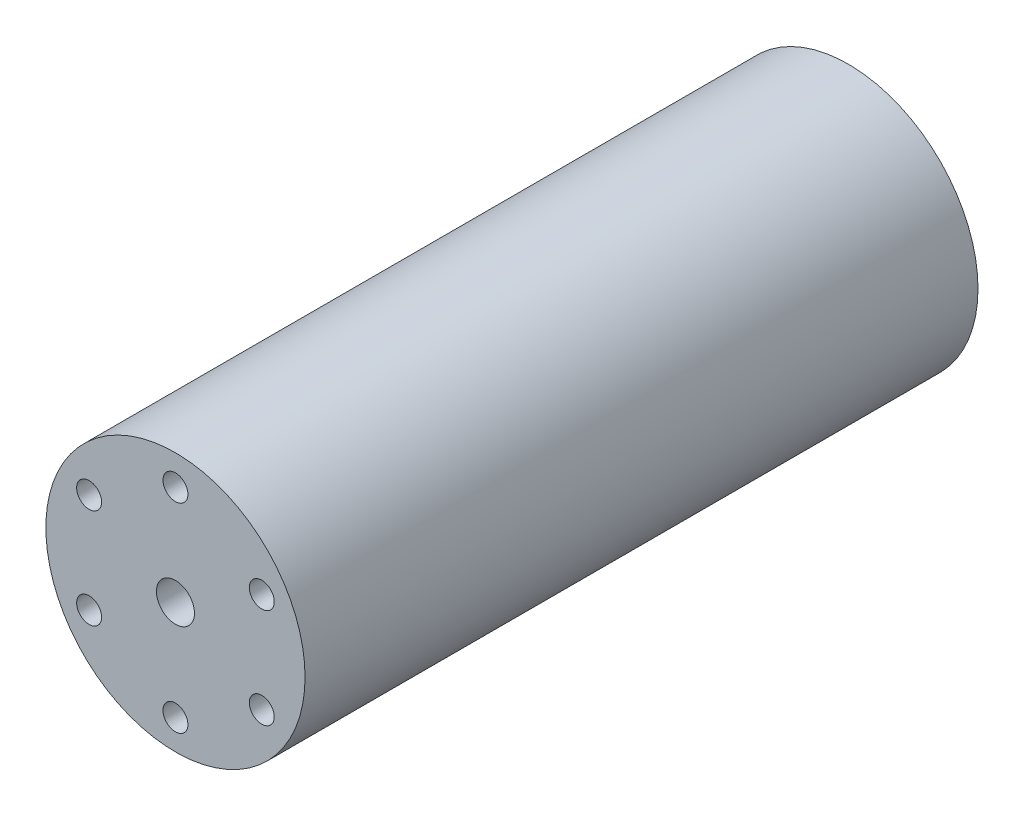
ISO-10303-21;
HEADER;
FILE_DESCRIPTION(('STEP AP214'),'2;1');
FILE_NAME('part.step','',(''),(''),'','','');
FILE_SCHEMA(('AUTOMOTIVE_DESIGN { 1 0 10303 214 1 1 1 1 }'));
ENDSEC;
DATA;
#1=APPLICATION_CONTEXT('core data for automotive mechanical design processes');
#2=APPLICATION_PROTOCOL_DEFINITION('international standard','automotive_design',2000,#1);
#3=PRODUCT_CONTEXT('',#1,'mechanical');
#4=PRODUCT('Part','Part','',(#3));
#5=PRODUCT_RELATED_PRODUCT_CATEGORY('part','',(#4));
#6=PRODUCT_DEFINITION_FORMATION('','',#4);
#7=PRODUCT_DEFINITION_CONTEXT('part definition',#1,'design');
#8=PRODUCT_DEFINITION('design','',#6,#7);
#9=PRODUCT_DEFINITION_SHAPE('','',#8);
#10=(LENGTH_UNIT() NAMED_UNIT(*) SI_UNIT(.MILLI.,.METRE.));
#11=(NAMED_UNIT(*) PLANE_ANGLE_UNIT() SI_UNIT($,.RADIAN.));
#12=(NAMED_UNIT(*) SI_UNIT($,.STERADIAN.) SOLID_ANGLE_UNIT());
#13=UNCERTAINTY_MEASURE_WITH_UNIT(LENGTH_MEASURE(1.E-05),#10,'distance_accuracy_value','');
#14=(GEOMETRIC_REPRESENTATION_CONTEXT(3) GLOBAL_UNCERTAINTY_ASSIGNED_CONTEXT((#13)) GLOBAL_UNIT_ASSIGNED_CONTEXT((#10,
#11,#12)) REPRESENTATION_CONTEXT('',''));
#15=CARTESIAN_POINT('',(0.,0.,0.));
#16=DIRECTION('',(0.,0.,1.));
#17=DIRECTION('',(1.,0.,0.));
#18=AXIS2_PLACEMENT_3D('',#15,#16,#17);
#19=CARTESIAN_POINT('',(0.,0.,135.));
#20=DIRECTION('',(0.,0.,-1.));
#21=DIRECTION('',(-1.,0.,0.));
#22=AXIS2_PLACEMENT_3D('',#19,#20,#21);
#23=CYLINDRICAL_SURFACE('',#22,3.815);
#24=CARTESIAN_POINT('',(0.,0.,135.));
#25=DIRECTION('',(0.,0.,-1.));
#26=DIRECTION('',(-1.,0.,0.));
#27=AXIS2_PLACEMENT_3D('',#24,#25,#26);
#28=CIRCLE('',#27,3.815);
#29=CARTESIAN_POINT('',(-3.815,0.,135.));
#30=VERTEX_POINT('',#29);
#31=EDGE_CURVE('E44',#30,#30,#28,.T.);
#32=ORIENTED_EDGE('',*,*,#31,.F.);
#33=EDGE_LOOP('',(#32));
#34=FACE_BOUND('',#33,.T.);
#35=CARTESIAN_POINT('',(0.,0.,30.));
#36=DIRECTION('',(0.,0.,-1.));
#37=DIRECTION('',(-1.,0.,0.));
#38=AXIS2_PLACEMENT_3D('',#35,#36,#37);
#39=CIRCLE('',#38,3.815);
#40=CARTESIAN_POINT('',(-3.815,0.,30.));
#41=VERTEX_POINT('',#40);
#42=EDGE_CURVE('E35',#41,#41,#39,.F.);
#43=ORIENTED_EDGE('',*,*,#42,.F.);
#44=EDGE_LOOP('',(#43));
#45=FACE_BOUND('',#44,.T.);
#46=ADVANCED_FACE('F31',(#34,#45),#23,.F.);
#47=CARTESIAN_POINT('',(0.,0.,135.));
#48=DIRECTION('',(0.,0.,-1.));
#49=DIRECTION('',(-1.,0.,0.));
#50=AXIS2_PLACEMENT_3D('',#47,#48,#49);
#51=CYLINDRICAL_SURFACE('',#50,26.);
#52=CARTESIAN_POINT('',(0.,0.,135.));
#53=DIRECTION('',(0.,0.,1.));
#54=DIRECTION('',(1.,0.,0.));
#55=AXIS2_PLACEMENT_3D('',#52,#53,#54);
#56=CIRCLE('',#55,26.);
#57=CARTESIAN_POINT('',(26.,0.,135.));
#58=VERTEX_POINT('',#57);
#59=EDGE_CURVE('E10',#58,#58,#56,.T.);
#60=ORIENTED_EDGE('',*,*,#59,.F.);
#61=EDGE_LOOP('',(#60));
#62=FACE_BOUND('',#61,.T.);
#63=CARTESIAN_POINT('',(0.,0.,0.));
#64=DIRECTION('',(0.,0.,1.));
#65=DIRECTION('',(1.,0.,0.));
#66=AXIS2_PLACEMENT_3D('',#63,#64,#65);
#67=CIRCLE('',#66,26.);
#68=CARTESIAN_POINT('',(26.,0.,0.));
#69=VERTEX_POINT('',#68);
#70=EDGE_CURVE('E39',#69,#69,#67,.T.);
#71=ORIENTED_EDGE('',*,*,#70,.T.);
#72=EDGE_LOOP('',(#71));
#73=FACE_BOUND('',#72,.T.);
#74=ADVANCED_FACE('F33',(#62,#73),#51,.T.);
#75=CARTESIAN_POINT('',(0.,0.,135.));
#76=DIRECTION('',(0.,0.,1.));
#77=DIRECTION('',(1.,0.,0.));
#78=AXIS2_PLACEMENT_3D('',#75,#76,#77);
#79=PLANE('',#78);
#80=CARTESIAN_POINT('',(-17.3205080756884,9.99999999999925,135.));
#81=DIRECTION('',(0.,0.,1.));
#82=DIRECTION('',(1.,0.,0.));
#83=AXIS2_PLACEMENT_3D('',#80,#81,#82);
#84=CIRCLE('',#83,2.50000000000086);
#85=CARTESIAN_POINT('',(-14.8205080756875,9.99999999999925,135.));
#86=VERTEX_POINT('',#85);
#87=EDGE_CURVE('E85',#86,#86,#84,.T.);
#88=ORIENTED_EDGE('',*,*,#87,.F.);
#89=EDGE_LOOP('',(#88));
#90=FACE_BOUND('',#89,.T.);
#91=CARTESIAN_POINT('',(-17.3205080756875,-10.0000000000007,135.));
#92=DIRECTION('',(0.,0.,1.));
#93=DIRECTION('',(1.,0.,0.));
#94=AXIS2_PLACEMENT_3D('',#91,#92,#93);
#95=CIRCLE('',#94,2.50000000000161);
#96=CARTESIAN_POINT('',(-14.8205080756859,-10.0000000000007,135.));
#97=VERTEX_POINT('',#96);
#98=EDGE_CURVE('E61',#97,#97,#95,.T.);
#99=ORIENTED_EDGE('',*,*,#98,.F.);
#100=EDGE_LOOP('',(#99));
#101=FACE_BOUND('',#100,.T.);
#102=CARTESIAN_POINT('',(1.70040397862765E-12,-20.,135.));
#103=DIRECTION('',(0.,0.,1.));
#104=DIRECTION('',(1.,0.,0.));
#105=AXIS2_PLACEMENT_3D('',#102,#103,#104);
#106=CIRCLE('',#105,2.50000000000176);
#107=CARTESIAN_POINT('',(2.50000000000346,-20.,135.));
#108=VERTEX_POINT('',#107);
#109=EDGE_CURVE('E68',#108,#108,#106,.T.);
#110=ORIENTED_EDGE('',*,*,#109,.F.);
#111=EDGE_LOOP('',(#110));
#112=FACE_BOUND('',#111,.T.);
#113=CARTESIAN_POINT('',(17.3205080756901,-9.99999999999926,135.));
#114=DIRECTION('',(0.,0.,1.));
#115=DIRECTION('',(1.,0.,0.));
#116=AXIS2_PLACEMENT_3D('',#113,#114,#115);
#117=CIRCLE('',#116,2.5000000000011);
#118=CARTESIAN_POINT('',(19.8205080756911,-9.99999999999926,135.));
#119=VERTEX_POINT('',#118);
#120=EDGE_CURVE('E74',#119,#119,#117,.T.);
#121=ORIENTED_EDGE('',*,*,#120,.F.);
#122=EDGE_LOOP('',(#121));
#123=FACE_BOUND('',#122,.T.);
#124=CARTESIAN_POINT('',(17.3205080756892,10.0000000000007,135.));
#125=DIRECTION('',(0.,0.,1.));
#126=DIRECTION('',(1.,0.,0.));
#127=AXIS2_PLACEMENT_3D('',#124,#125,#126);
#128=CIRCLE('',#127,2.50000000000024);
#129=CARTESIAN_POINT('',(19.8205080756894,10.0000000000007,135.));
#130=VERTEX_POINT('',#129);
#131=EDGE_CURVE('E80',#130,#130,#128,.T.);
#132=ORIENTED_EDGE('',*,*,#131,.F.);
#133=EDGE_LOOP('',(#132));
#134=FACE_BOUND('',#133,.T.);
#135=CARTESIAN_POINT('',(0.,20.,135.));
#136=DIRECTION('',(0.,0.,1.));
#137=DIRECTION('',(1.,0.,0.));
#138=AXIS2_PLACEMENT_3D('',#135,#136,#137);
#139=CIRCLE('',#138,2.5);
#140=CARTESIAN_POINT('',(2.5,20.,135.));
#141=VERTEX_POINT('',#140);
#142=EDGE_CURVE('E55',#141,#141,#139,.T.);
#143=ORIENTED_EDGE('',*,*,#142,.F.);
#144=EDGE_LOOP('',(#143));
#145=FACE_BOUND('',#144,.T.);
#146=ORIENTED_EDGE('',*,*,#31,.T.);
#147=EDGE_LOOP('',(#146));
#148=FACE_BOUND('',#147,.T.);
#149=ORIENTED_EDGE('',*,*,#59,.T.);
#150=EDGE_LOOP('',(#149));
#151=FACE_BOUND('',#150,.T.);
#152=ADVANCED_FACE('F100',(#90,#101,#112,#123,#134,#145,#148,#151),#79,.T.);
#153=CARTESIAN_POINT('',(0.,0.,0.));
#154=DIRECTION('',(0.,0.,1.));
#155=DIRECTION('',(1.,0.,0.));
#156=AXIS2_PLACEMENT_3D('',#153,#154,#155);
#157=PLANE('',#156);
#158=CARTESIAN_POINT('',(0.,0.,0.));
#159=DIRECTION('',(0.,0.,-1.));
#160=DIRECTION('',(-1.,0.,0.));
#161=AXIS2_PLACEMENT_3D('',#158,#159,#160);
#162=CIRCLE('',#161,18.5);
#163=CARTESIAN_POINT('',(-18.5,0.,0.));
#164=VERTEX_POINT('',#163);
#165=EDGE_CURVE('E48',#164,#164,#162,.T.);
#166=ORIENTED_EDGE('',*,*,#165,.F.);
#167=EDGE_LOOP('',(#166));
#168=FACE_BOUND('',#167,.T.);
#169=ORIENTED_EDGE('',*,*,#70,.F.);
#170=EDGE_LOOP('',(#169));
#171=FACE_BOUND('',#170,.T.);
#172=ADVANCED_FACE('F103',(#168,#171),#157,.F.);
#173=CARTESIAN_POINT('',(0.,0.,30.));
#174=DIRECTION('',(0.,0.,-1.));
#175=DIRECTION('',(-1.,0.,0.));
#176=AXIS2_PLACEMENT_3D('',#173,#174,#175);
#177=PLANE('',#176);
#178=CARTESIAN_POINT('',(0.,0.,30.));
#179=DIRECTION('',(0.,0.,-1.));
#180=DIRECTION('',(-1.,0.,0.));
#181=AXIS2_PLACEMENT_3D('',#178,#179,#180);
#182=CIRCLE('',#181,18.5);
#183=CARTESIAN_POINT('',(-18.5,0.,30.));
#184=VERTEX_POINT('',#183);
#185=EDGE_CURVE('E51',#184,#184,#182,.T.);
#186=ORIENTED_EDGE('',*,*,#185,.T.);
#187=EDGE_LOOP('',(#186));
#188=FACE_BOUND('',#187,.T.);
#189=ORIENTED_EDGE('',*,*,#42,.T.);
#190=EDGE_LOOP('',(#189));
#191=FACE_BOUND('',#190,.T.);
#192=ADVANCED_FACE('F123',(#188,#191),#177,.T.);
#193=CARTESIAN_POINT('',(0.,0.,30.));
#194=DIRECTION('',(0.,0.,-1.));
#195=DIRECTION('',(-1.,0.,0.));
#196=AXIS2_PLACEMENT_3D('',#193,#194,#195);
#197=CYLINDRICAL_SURFACE('',#196,18.5);
#198=ORIENTED_EDGE('',*,*,#185,.F.);
#199=EDGE_LOOP('',(#198));
#200=FACE_BOUND('',#199,.T.);
#201=ORIENTED_EDGE('',*,*,#165,.T.);
#202=EDGE_LOOP('',(#201));
#203=FACE_BOUND('',#202,.T.);
#204=ADVANCED_FACE('F125',(#200,#203),#197,.F.);
#205=CARTESIAN_POINT('',(0.,20.,130.));
#206=DIRECTION('',(0.,0.,1.));
#207=DIRECTION('',(1.,0.,0.));
#208=AXIS2_PLACEMENT_3D('',#205,#206,#207);
#209=CYLINDRICAL_SURFACE('',#208,2.5);
#210=CARTESIAN_POINT('',(0.,20.,130.));
#211=DIRECTION('',(0.,0.,1.));
#212=DIRECTION('',(1.,0.,0.));
#213=AXIS2_PLACEMENT_3D('',#210,#211,#212);
#214=CIRCLE('',#213,2.5);
#215=CARTESIAN_POINT('',(2.5,20.,130.));
#216=VERTEX_POINT('',#215);
#217=EDGE_CURVE('E52',#216,#216,#214,.T.);
#218=ORIENTED_EDGE('',*,*,#217,.F.);
#219=EDGE_LOOP('',(#218));
#220=FACE_BOUND('',#219,.T.);
#221=ORIENTED_EDGE('',*,*,#142,.T.);
#222=EDGE_LOOP('',(#221));
#223=FACE_BOUND('',#222,.T.);
#224=ADVANCED_FACE('F132',(#220,#223),#209,.F.);
#225=CARTESIAN_POINT('',(0.,20.,130.));
#226=DIRECTION('',(0.,0.,1.));
#227=DIRECTION('',(1.,0.,0.));
#228=AXIS2_PLACEMENT_3D('',#225,#226,#227);
#229=PLANE('',#228);
#230=ORIENTED_EDGE('',*,*,#217,.T.);
#231=EDGE_LOOP('',(#230));
#232=FACE_BOUND('',#231,.T.);
#233=ADVANCED_FACE('F139',(#232),#229,.T.);
#234=CARTESIAN_POINT('',(17.3205080756892,10.0000000000007,130.));
#235=DIRECTION('',(0.,0.,1.));
#236=DIRECTION('',(1.,0.,0.));
#237=AXIS2_PLACEMENT_3D('',#234,#235,#236);
#238=CYLINDRICAL_SURFACE('',#237,2.50000000000024);
#239=CARTESIAN_POINT('',(17.3205080756892,10.0000000000007,130.));
#240=DIRECTION('',(0.,0.,1.));
#241=DIRECTION('',(1.,0.,0.));
#242=AXIS2_PLACEMENT_3D('',#239,#240,#241);
#243=CIRCLE('',#242,2.50000000000024);
#244=CARTESIAN_POINT('',(19.8205080756894,10.0000000000007,130.));
#245=VERTEX_POINT('',#244);
#246=EDGE_CURVE('E58',#245,#245,#243,.T.);
#247=ORIENTED_EDGE('',*,*,#246,.F.);
#248=EDGE_LOOP('',(#247));
#249=FACE_BOUND('',#248,.T.);
#250=ORIENTED_EDGE('',*,*,#131,.T.);
#251=EDGE_LOOP('',(#250));
#252=FACE_BOUND('',#251,.T.);
#253=ADVANCED_FACE('F143',(#249,#252),#238,.F.);
#254=CARTESIAN_POINT('',(17.3205080756892,10.0000000000007,130.));
#255=DIRECTION('',(0.,0.,1.));
#256=DIRECTION('',(1.,0.,0.));
#257=AXIS2_PLACEMENT_3D('',#254,#255,#256);
#258=PLANE('',#257);
#259=ORIENTED_EDGE('',*,*,#246,.T.);
#260=EDGE_LOOP('',(#259));
#261=FACE_BOUND('',#260,.T.);
#262=ADVANCED_FACE('F164',(#261),#258,.T.);
#263=CARTESIAN_POINT('',(17.3205080756901,-9.99999999999926,130.));
#264=DIRECTION('',(0.,0.,1.));
#265=DIRECTION('',(1.,0.,0.));
#266=AXIS2_PLACEMENT_3D('',#263,#264,#265);
#267=CYLINDRICAL_SURFACE('',#266,2.5000000000011);
#268=CARTESIAN_POINT('',(17.3205080756901,-9.99999999999926,130.));
#269=DIRECTION('',(0.,0.,1.));
#270=DIRECTION('',(1.,0.,0.));
#271=AXIS2_PLACEMENT_3D('',#268,#269,#270);
#272=CIRCLE('',#271,2.5000000000011);
#273=CARTESIAN_POINT('',(19.8205080756911,-9.99999999999926,130.));
#274=VERTEX_POINT('',#273);
#275=EDGE_CURVE('E77',#274,#274,#272,.T.);
#276=ORIENTED_EDGE('',*,*,#275,.F.);
#277=EDGE_LOOP('',(#276));
#278=FACE_BOUND('',#277,.T.);
#279=ORIENTED_EDGE('',*,*,#120,.T.);
#280=EDGE_LOOP('',(#279));
#281=FACE_BOUND('',#280,.T.);
#282=ADVANCED_FACE('F161',(#278,#281),#267,.F.);
#283=CARTESIAN_POINT('',(17.3205080756901,-9.99999999999926,130.));
#284=DIRECTION('',(0.,0.,1.));
#285=DIRECTION('',(1.,0.,0.));
#286=AXIS2_PLACEMENT_3D('',#283,#284,#285);
#287=PLANE('',#286);
#288=ORIENTED_EDGE('',*,*,#275,.T.);
#289=EDGE_LOOP('',(#288));
#290=FACE_BOUND('',#289,.T.);
#291=ADVANCED_FACE('F156',(#290),#287,.T.);
#292=CARTESIAN_POINT('',(1.70040397862765E-12,-20.,130.));
#293=DIRECTION('',(0.,0.,1.));
#294=DIRECTION('',(1.,0.,0.));
#295=AXIS2_PLACEMENT_3D('',#292,#293,#294);
#296=CYLINDRICAL_SURFACE('',#295,2.50000000000176);
#297=CARTESIAN_POINT('',(1.70040397862765E-12,-20.,130.));
#298=DIRECTION('',(0.,0.,1.));
#299=DIRECTION('',(1.,0.,0.));
#300=AXIS2_PLACEMENT_3D('',#297,#298,#299);
#301=CIRCLE('',#300,2.50000000000176);
#302=CARTESIAN_POINT('',(2.50000000000346,-20.,130.));
#303=VERTEX_POINT('',#302);
#304=EDGE_CURVE('E71',#303,#303,#301,.T.);
#305=ORIENTED_EDGE('',*,*,#304,.F.);
#306=EDGE_LOOP('',(#305));
#307=FACE_BOUND('',#306,.T.);
#308=ORIENTED_EDGE('',*,*,#109,.T.);
#309=EDGE_LOOP('',(#308));
#310=FACE_BOUND('',#309,.T.);
#311=ADVANCED_FACE('F153',(#307,#310),#296,.F.);
#312=CARTESIAN_POINT('',(1.70040397862765E-12,-20.,130.));
#313=DIRECTION('',(0.,0.,1.));
#314=DIRECTION('',(1.,0.,0.));
#315=AXIS2_PLACEMENT_3D('',#312,#313,#314);
#316=PLANE('',#315);
#317=ORIENTED_EDGE('',*,*,#304,.T.);
#318=EDGE_LOOP('',(#317));
#319=FACE_BOUND('',#318,.T.);
#320=ADVANCED_FACE('F148',(#319),#316,.T.);
#321=CARTESIAN_POINT('',(-17.3205080756875,-10.0000000000007,130.));
#322=DIRECTION('',(0.,0.,1.));
#323=DIRECTION('',(1.,0.,0.));
#324=AXIS2_PLACEMENT_3D('',#321,#322,#323);
#325=CYLINDRICAL_SURFACE('',#324,2.50000000000161);
#326=CARTESIAN_POINT('',(-17.3205080756875,-10.0000000000007,130.));
#327=DIRECTION('',(0.,0.,1.));
#328=DIRECTION('',(1.,0.,0.));
#329=AXIS2_PLACEMENT_3D('',#326,#327,#328);
#330=CIRCLE('',#329,2.50000000000161);
#331=CARTESIAN_POINT('',(-14.8205080756859,-10.0000000000007,130.));
#332=VERTEX_POINT('',#331);
#333=EDGE_CURVE('E64',#332,#332,#330,.T.);
#334=ORIENTED_EDGE('',*,*,#333,.F.);
#335=EDGE_LOOP('',(#334));
#336=FACE_BOUND('',#335,.T.);
#337=ORIENTED_EDGE('',*,*,#98,.T.);
#338=EDGE_LOOP('',(#337));
#339=FACE_BOUND('',#338,.T.);
#340=ADVANCED_FACE('F145',(#336,#339),#325,.F.);
#341=CARTESIAN_POINT('',(-17.3205080756875,-10.0000000000007,130.));
#342=DIRECTION('',(0.,0.,1.));
#343=DIRECTION('',(1.,0.,0.));
#344=AXIS2_PLACEMENT_3D('',#341,#342,#343);
#345=PLANE('',#344);
#346=ORIENTED_EDGE('',*,*,#333,.T.);
#347=EDGE_LOOP('',(#346));
#348=FACE_BOUND('',#347,.T.);
#349=ADVANCED_FACE('F96',(#348),#345,.T.);
#350=CARTESIAN_POINT('',(-17.3205080756884,9.99999999999925,130.));
#351=DIRECTION('',(0.,0.,1.));
#352=DIRECTION('',(1.,0.,0.));
#353=AXIS2_PLACEMENT_3D('',#350,#351,#352);
#354=CYLINDRICAL_SURFACE('',#353,2.50000000000086);
#355=CARTESIAN_POINT('',(-17.3205080756884,9.99999999999925,130.));
#356=DIRECTION('',(0.,0.,1.));
#357=DIRECTION('',(1.,0.,0.));
#358=AXIS2_PLACEMENT_3D('',#355,#356,#357);
#359=CIRCLE('',#358,2.50000000000086);
#360=CARTESIAN_POINT('',(-14.8205080756875,9.99999999999925,130.));
#361=VERTEX_POINT('',#360);
#362=EDGE_CURVE('E65',#361,#361,#359,.T.);
#363=ORIENTED_EDGE('',*,*,#362,.F.);
#364=EDGE_LOOP('',(#363));
#365=FACE_BOUND('',#364,.T.);
#366=ORIENTED_EDGE('',*,*,#87,.T.);
#367=EDGE_LOOP('',(#366));
#368=FACE_BOUND('',#367,.T.);
#369=ADVANCED_FACE('F93',(#365,#368),#354,.F.);
#370=CARTESIAN_POINT('',(-17.3205080756884,9.99999999999925,130.));
#371=DIRECTION('',(0.,0.,1.));
#372=DIRECTION('',(1.,0.,0.));
#373=AXIS2_PLACEMENT_3D('',#370,#371,#372);
#374=PLANE('',#373);
#375=ORIENTED_EDGE('',*,*,#362,.T.);
#376=EDGE_LOOP('',(#375));
#377=FACE_BOUND('',#376,.T.);
#378=ADVANCED_FACE('F91',(#377),#374,.T.);
#379=CLOSED_SHELL('',(#46,#74,#152,#172,#192,#204,#224,#233,#253,#262,#282,#291,#311,#320,#340,
#349,#369,#378));
#380=MANIFOLD_SOLID_BREP('B2',#379);
#381=ADVANCED_BREP_SHAPE_REPRESENTATION('',(#18,#380),#14);
#382=SHAPE_DEFINITION_REPRESENTATION(#9,#381);
ENDSEC;
END-ISO-10303-21;
